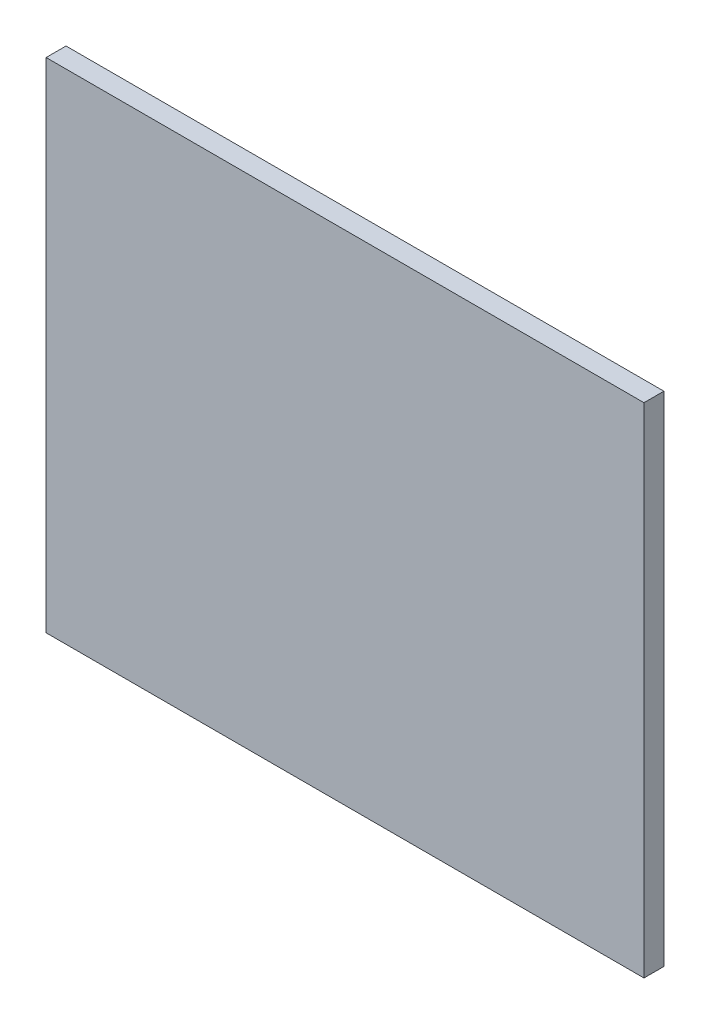
ISO-10303-21;
HEADER;
FILE_DESCRIPTION(('STEP AP214'),'2;1');
FILE_NAME('part.step','',(''),(''),'','','');
FILE_SCHEMA(('AUTOMOTIVE_DESIGN { 1 0 10303 214 1 1 1 1 }'));
ENDSEC;
DATA;
#1=APPLICATION_CONTEXT('core data for automotive mechanical design processes');
#2=APPLICATION_PROTOCOL_DEFINITION('international standard','automotive_design',2000,#1);
#3=PRODUCT_CONTEXT('',#1,'mechanical');
#4=PRODUCT('Part','Part','',(#3));
#5=PRODUCT_RELATED_PRODUCT_CATEGORY('part','',(#4));
#6=PRODUCT_DEFINITION_FORMATION('','',#4);
#7=PRODUCT_DEFINITION_CONTEXT('part definition',#1,'design');
#8=PRODUCT_DEFINITION('design','',#6,#7);
#9=PRODUCT_DEFINITION_SHAPE('','',#8);
#10=(LENGTH_UNIT() NAMED_UNIT(*) SI_UNIT(.MILLI.,.METRE.));
#11=(NAMED_UNIT(*) PLANE_ANGLE_UNIT() SI_UNIT($,.RADIAN.));
#12=(NAMED_UNIT(*) SI_UNIT($,.STERADIAN.) SOLID_ANGLE_UNIT());
#13=UNCERTAINTY_MEASURE_WITH_UNIT(LENGTH_MEASURE(1.E-05),#10,'distance_accuracy_value','');
#14=(GEOMETRIC_REPRESENTATION_CONTEXT(3) GLOBAL_UNCERTAINTY_ASSIGNED_CONTEXT((#13)) GLOBAL_UNIT_ASSIGNED_CONTEXT((#10,
#11,#12)) REPRESENTATION_CONTEXT('',''));
#15=CARTESIAN_POINT('',(0.,0.,0.));
#16=DIRECTION('',(0.,0.,1.));
#17=DIRECTION('',(1.,0.,0.));
#18=AXIS2_PLACEMENT_3D('',#15,#16,#17);
#19=CARTESIAN_POINT('',(-30.,-25.,2.));
#20=DIRECTION('',(1.,0.,0.));
#21=DIRECTION('',(0.,0.,-1.));
#22=AXIS2_PLACEMENT_3D('',#19,#20,#21);
#23=PLANE('',#22);
#24=DIRECTION('',(0.,-1.,0.));
#25=VECTOR('',#24,1.);
#26=CARTESIAN_POINT('',(-30.,-25.,0.));
#27=LINE('',#26,#25);
#28=CARTESIAN_POINT('',(-30.,25.,0.));
#29=VERTEX_POINT('',#28);
#30=CARTESIAN_POINT('',(-30.,-25.,0.));
#31=VERTEX_POINT('',#30);
#32=EDGE_CURVE('E107',#29,#31,#27,.T.);
#33=ORIENTED_EDGE('',*,*,#32,.T.);
#34=DIRECTION('',(0.,0.,-1.));
#35=VECTOR('',#34,1.);
#36=CARTESIAN_POINT('',(-30.,-25.,2.));
#37=LINE('',#36,#35);
#38=CARTESIAN_POINT('',(-30.,-25.,2.));
#39=VERTEX_POINT('',#38);
#40=EDGE_CURVE('E11',#39,#31,#37,.T.);
#41=ORIENTED_EDGE('',*,*,#40,.F.);
#42=DIRECTION('',(0.,-1.,0.));
#43=VECTOR('',#42,1.);
#44=CARTESIAN_POINT('',(-30.,-25.,2.));
#45=LINE('',#44,#43);
#46=CARTESIAN_POINT('',(-30.,25.,2.));
#47=VERTEX_POINT('',#46);
#48=EDGE_CURVE('E91',#47,#39,#45,.T.);
#49=ORIENTED_EDGE('',*,*,#48,.F.);
#50=DIRECTION('',(0.,0.,-1.));
#51=VECTOR('',#50,1.);
#52=CARTESIAN_POINT('',(-30.,25.,2.));
#53=LINE('',#52,#51);
#54=EDGE_CURVE('E103',#47,#29,#53,.T.);
#55=ORIENTED_EDGE('',*,*,#54,.T.);
#56=EDGE_LOOP('',(#33,#41,#49,#55));
#57=FACE_BOUND('',#56,.T.);
#58=ADVANCED_FACE('F39',(#57),#23,.F.);
#59=CARTESIAN_POINT('',(30.,-25.,2.));
#60=DIRECTION('',(0.,1.,0.));
#61=DIRECTION('',(-1.,0.,0.));
#62=AXIS2_PLACEMENT_3D('',#59,#60,#61);
#63=PLANE('',#62);
#64=DIRECTION('',(1.,0.,0.));
#65=VECTOR('',#64,1.);
#66=CARTESIAN_POINT('',(30.,-25.,0.));
#67=LINE('',#66,#65);
#68=CARTESIAN_POINT('',(30.,-25.,0.));
#69=VERTEX_POINT('',#68);
#70=EDGE_CURVE('E96',#31,#69,#67,.T.);
#71=ORIENTED_EDGE('',*,*,#70,.T.);
#72=DIRECTION('',(0.,0.,-1.));
#73=VECTOR('',#72,1.);
#74=CARTESIAN_POINT('',(30.,-25.,2.));
#75=LINE('',#74,#73);
#76=CARTESIAN_POINT('',(30.,-25.,2.));
#77=VERTEX_POINT('',#76);
#78=EDGE_CURVE('E48',#77,#69,#75,.T.);
#79=ORIENTED_EDGE('',*,*,#78,.F.);
#80=DIRECTION('',(1.,0.,0.));
#81=VECTOR('',#80,1.);
#82=CARTESIAN_POINT('',(30.,-25.,2.));
#83=LINE('',#82,#81);
#84=EDGE_CURVE('E86',#39,#77,#83,.T.);
#85=ORIENTED_EDGE('',*,*,#84,.F.);
#86=ORIENTED_EDGE('',*,*,#40,.T.);
#87=EDGE_LOOP('',(#71,#79,#85,#86));
#88=FACE_BOUND('',#87,.T.);
#89=ADVANCED_FACE('F95',(#88),#63,.F.);
#90=CARTESIAN_POINT('',(30.,-25.,2.));
#91=DIRECTION('',(-1.,0.,0.));
#92=DIRECTION('',(0.,0.,1.));
#93=AXIS2_PLACEMENT_3D('',#90,#91,#92);
#94=PLANE('',#93);
#95=DIRECTION('',(0.,1.,0.));
#96=VECTOR('',#95,1.);
#97=CARTESIAN_POINT('',(30.,-25.,0.));
#98=LINE('',#97,#96);
#99=CARTESIAN_POINT('',(30.,25.,0.));
#100=VERTEX_POINT('',#99);
#101=EDGE_CURVE('E73',#69,#100,#98,.T.);
#102=ORIENTED_EDGE('',*,*,#101,.T.);
#103=DIRECTION('',(0.,0.,-1.));
#104=VECTOR('',#103,1.);
#105=CARTESIAN_POINT('',(30.,25.,2.));
#106=LINE('',#105,#104);
#107=CARTESIAN_POINT('',(30.,25.,2.));
#108=VERTEX_POINT('',#107);
#109=EDGE_CURVE('E98',#108,#100,#106,.T.);
#110=ORIENTED_EDGE('',*,*,#109,.F.);
#111=DIRECTION('',(0.,1.,0.));
#112=VECTOR('',#111,1.);
#113=CARTESIAN_POINT('',(30.,-25.,2.));
#114=LINE('',#113,#112);
#115=EDGE_CURVE('E89',#77,#108,#114,.T.);
#116=ORIENTED_EDGE('',*,*,#115,.F.);
#117=ORIENTED_EDGE('',*,*,#78,.T.);
#118=EDGE_LOOP('',(#102,#110,#116,#117));
#119=FACE_BOUND('',#118,.T.);
#120=ADVANCED_FACE('F99',(#119),#94,.F.);
#121=CARTESIAN_POINT('',(30.,25.,2.));
#122=DIRECTION('',(0.,-1.,0.));
#123=DIRECTION('',(1.,0.,0.));
#124=AXIS2_PLACEMENT_3D('',#121,#122,#123);
#125=PLANE('',#124);
#126=DIRECTION('',(-1.,0.,0.));
#127=VECTOR('',#126,1.);
#128=CARTESIAN_POINT('',(30.,25.,0.));
#129=LINE('',#128,#127);
#130=EDGE_CURVE('E79',#100,#29,#129,.T.);
#131=ORIENTED_EDGE('',*,*,#130,.T.);
#132=ORIENTED_EDGE('',*,*,#54,.F.);
#133=DIRECTION('',(-1.,0.,0.));
#134=VECTOR('',#133,1.);
#135=CARTESIAN_POINT('',(30.,25.,2.));
#136=LINE('',#135,#134);
#137=EDGE_CURVE('E56',#108,#47,#136,.T.);
#138=ORIENTED_EDGE('',*,*,#137,.F.);
#139=ORIENTED_EDGE('',*,*,#109,.T.);
#140=EDGE_LOOP('',(#131,#132,#138,#139));
#141=FACE_BOUND('',#140,.T.);
#142=ADVANCED_FACE('F120',(#141),#125,.F.);
#143=CARTESIAN_POINT('',(0.,0.,2.));
#144=DIRECTION('',(0.,0.,1.));
#145=DIRECTION('',(1.,0.,0.));
#146=AXIS2_PLACEMENT_3D('',#143,#144,#145);
#147=PLANE('',#146);
#148=ORIENTED_EDGE('',*,*,#48,.T.);
#149=ORIENTED_EDGE('',*,*,#84,.T.);
#150=ORIENTED_EDGE('',*,*,#115,.T.);
#151=ORIENTED_EDGE('',*,*,#137,.T.);
#152=EDGE_LOOP('',(#148,#149,#150,#151));
#153=FACE_BOUND('',#152,.T.);
#154=ADVANCED_FACE('F87',(#153),#147,.T.);
#155=CARTESIAN_POINT('',(0.,0.,0.));
#156=DIRECTION('',(0.,0.,1.));
#157=DIRECTION('',(1.,0.,0.));
#158=AXIS2_PLACEMENT_3D('',#155,#156,#157);
#159=PLANE('',#158);
#160=ORIENTED_EDGE('',*,*,#32,.F.);
#161=ORIENTED_EDGE('',*,*,#130,.F.);
#162=ORIENTED_EDGE('',*,*,#101,.F.);
#163=ORIENTED_EDGE('',*,*,#70,.F.);
#164=EDGE_LOOP('',(#160,#161,#162,#163));
#165=FACE_BOUND('',#164,.T.);
#166=ADVANCED_FACE('F123',(#165),#159,.F.);
#167=CLOSED_SHELL('',(#58,#89,#120,#142,#154,#166));
#168=MANIFOLD_SOLID_BREP('B2',#167);
#169=ADVANCED_BREP_SHAPE_REPRESENTATION('',(#18,#168),#14);
#170=SHAPE_DEFINITION_REPRESENTATION(#9,#169);
ENDSEC;
END-ISO-10303-21;
